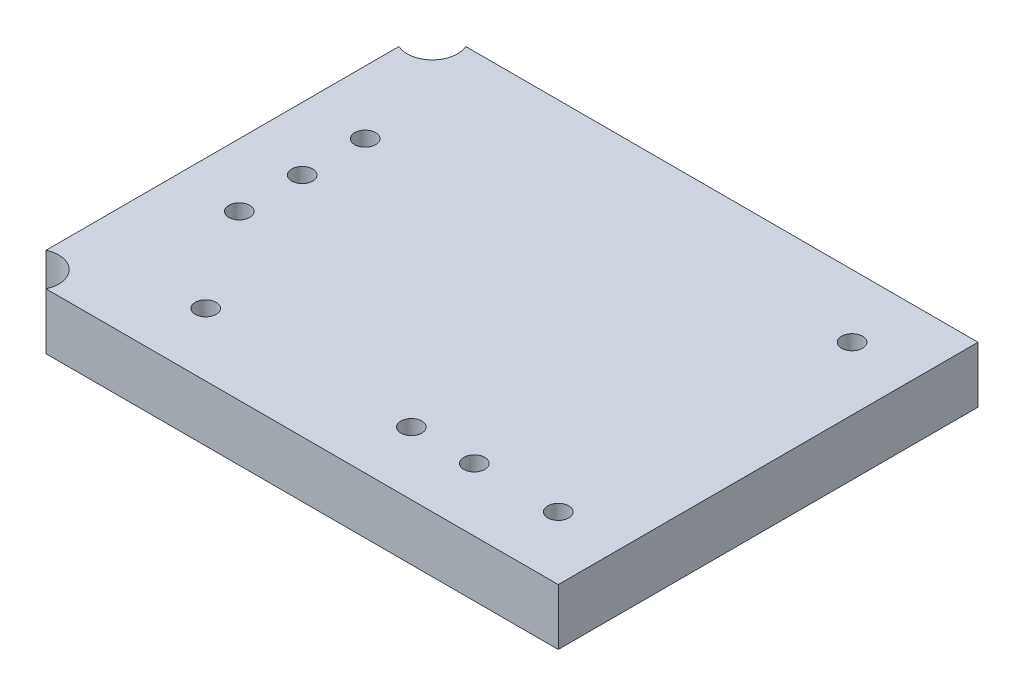
ISO-10303-21;
HEADER;
FILE_DESCRIPTION(('STEP AP214'),'2;1');
FILE_NAME('part.step','',(''),(''),'','','');
FILE_SCHEMA(('AUTOMOTIVE_DESIGN { 1 0 10303 214 1 1 1 1 }'));
ENDSEC;
DATA;
#1=APPLICATION_CONTEXT('core data for automotive mechanical design processes');
#2=APPLICATION_PROTOCOL_DEFINITION('international standard','automotive_design',2000,#1);
#3=PRODUCT_CONTEXT('',#1,'mechanical');
#4=PRODUCT('Part','Part','',(#3));
#5=PRODUCT_RELATED_PRODUCT_CATEGORY('part','',(#4));
#6=PRODUCT_DEFINITION_FORMATION('','',#4);
#7=PRODUCT_DEFINITION_CONTEXT('part definition',#1,'design');
#8=PRODUCT_DEFINITION('design','',#6,#7);
#9=PRODUCT_DEFINITION_SHAPE('','',#8);
#10=(LENGTH_UNIT() NAMED_UNIT(*) SI_UNIT(.MILLI.,.METRE.));
#11=(NAMED_UNIT(*) PLANE_ANGLE_UNIT() SI_UNIT($,.RADIAN.));
#12=(NAMED_UNIT(*) SI_UNIT($,.STERADIAN.) SOLID_ANGLE_UNIT());
#13=UNCERTAINTY_MEASURE_WITH_UNIT(LENGTH_MEASURE(1.E-05),#10,'distance_accuracy_value','');
#14=(GEOMETRIC_REPRESENTATION_CONTEXT(3) GLOBAL_UNCERTAINTY_ASSIGNED_CONTEXT((#13)) GLOBAL_UNIT_ASSIGNED_CONTEXT((#10,
#11,#12)) REPRESENTATION_CONTEXT('',''));
#15=CARTESIAN_POINT('',(0.,0.,0.));
#16=DIRECTION('',(0.,0.,1.));
#17=DIRECTION('',(1.,0.,0.));
#18=AXIS2_PLACEMENT_3D('',#15,#16,#17);
#19=CARTESIAN_POINT('',(6.5,1.34,0.));
#20=DIRECTION('',(1.,0.,0.));
#21=DIRECTION('',(0.,0.,-1.));
#22=AXIS2_PLACEMENT_3D('',#19,#20,#21);
#23=PLANE('',#22);
#24=DIRECTION('',(0.,0.,1.));
#25=VECTOR('',#24,1.);
#26=CARTESIAN_POINT('',(6.5,0.,0.));
#27=LINE('',#26,#25);
#28=CARTESIAN_POINT('',(6.5,0.,-5.));
#29=VERTEX_POINT('',#28);
#30=CARTESIAN_POINT('',(6.5,0.,5.));
#31=VERTEX_POINT('',#30);
#32=EDGE_CURVE('E117',#29,#31,#27,.T.);
#33=ORIENTED_EDGE('',*,*,#32,.F.);
#34=DIRECTION('',(0.,-1.,0.));
#35=VECTOR('',#34,1.);
#36=CARTESIAN_POINT('',(6.5,1.34,-5.));
#37=LINE('',#36,#35);
#38=CARTESIAN_POINT('',(6.5,1.34,-5.));
#39=VERTEX_POINT('',#38);
#40=EDGE_CURVE('E11',#39,#29,#37,.T.);
#41=ORIENTED_EDGE('',*,*,#40,.F.);
#42=DIRECTION('',(0.,0.,1.));
#43=VECTOR('',#42,1.);
#44=CARTESIAN_POINT('',(6.5,1.34,0.));
#45=LINE('',#44,#43);
#46=CARTESIAN_POINT('',(6.5,1.34,5.));
#47=VERTEX_POINT('',#46);
#48=EDGE_CURVE('E132',#39,#47,#45,.T.);
#49=ORIENTED_EDGE('',*,*,#48,.T.);
#50=DIRECTION('',(0.,-1.,0.));
#51=VECTOR('',#50,1.);
#52=CARTESIAN_POINT('',(6.5,1.34,5.));
#53=LINE('',#52,#51);
#54=EDGE_CURVE('E80',#47,#31,#53,.T.);
#55=ORIENTED_EDGE('',*,*,#54,.T.);
#56=EDGE_LOOP('',(#33,#41,#49,#55));
#57=FACE_BOUND('',#56,.T.);
#58=ADVANCED_FACE('F36',(#57),#23,.T.);
#59=CARTESIAN_POINT('',(0.,1.34,-5.));
#60=DIRECTION('',(0.,0.,-1.));
#61=DIRECTION('',(-1.,0.,0.));
#62=AXIS2_PLACEMENT_3D('',#59,#60,#61);
#63=PLANE('',#62);
#64=DIRECTION('',(1.,0.,0.));
#65=VECTOR('',#64,1.);
#66=CARTESIAN_POINT('',(0.,0.,-5.));
#67=LINE('',#66,#65);
#68=CARTESIAN_POINT('',(-5.70456439426821,0.,-5.));
#69=VERTEX_POINT('',#68);
#70=EDGE_CURVE('E120',#69,#29,#67,.T.);
#71=ORIENTED_EDGE('',*,*,#70,.F.);
#72=DIRECTION('',(0.,-1.,0.));
#73=VECTOR('',#72,1.);
#74=CARTESIAN_POINT('',(-5.70456439426821,1.34,-5.));
#75=LINE('',#74,#73);
#76=CARTESIAN_POINT('',(-5.70456439426821,1.34,-5.));
#77=VERTEX_POINT('',#76);
#78=EDGE_CURVE('E44',#77,#69,#75,.T.);
#79=ORIENTED_EDGE('',*,*,#78,.F.);
#80=DIRECTION('',(1.,0.,0.));
#81=VECTOR('',#80,1.);
#82=CARTESIAN_POINT('',(0.,1.34,-5.));
#83=LINE('',#82,#81);
#84=EDGE_CURVE('E145',#77,#39,#83,.T.);
#85=ORIENTED_EDGE('',*,*,#84,.T.);
#86=ORIENTED_EDGE('',*,*,#40,.T.);
#87=EDGE_LOOP('',(#71,#79,#85,#86));
#88=FACE_BOUND('',#87,.T.);
#89=ADVANCED_FACE('F141',(#88),#63,.T.);
#90=CARTESIAN_POINT('',(-6.25,1.34,-4.75));
#91=DIRECTION('',(0.,-1.,0.));
#92=DIRECTION('',(0.,0.,-1.));
#93=AXIS2_PLACEMENT_3D('',#90,#91,#92);
#94=CYLINDRICAL_SURFACE('',#93,0.6);
#95=CARTESIAN_POINT('',(-6.25,0.,-4.75));
#96=DIRECTION('',(0.,1.,0.));
#97=DIRECTION('',(0.,0.,1.));
#98=AXIS2_PLACEMENT_3D('',#95,#96,#97);
#99=CIRCLE('',#98,0.6);
#100=CARTESIAN_POINT('',(-6.5,0.,-4.20456439426822));
#101=VERTEX_POINT('',#100);
#102=EDGE_CURVE('E124',#101,#69,#99,.T.);
#103=ORIENTED_EDGE('',*,*,#102,.F.);
#104=DIRECTION('',(0.,-1.,0.));
#105=VECTOR('',#104,1.);
#106=CARTESIAN_POINT('',(-6.5,1.34,-4.20456439426822));
#107=LINE('',#106,#105);
#108=CARTESIAN_POINT('',(-6.5,1.34,-4.20456439426822));
#109=VERTEX_POINT('',#108);
#110=EDGE_CURVE('E110',#109,#101,#107,.T.);
#111=ORIENTED_EDGE('',*,*,#110,.F.);
#112=CARTESIAN_POINT('',(-6.25,1.34,-4.75));
#113=DIRECTION('',(0.,1.,0.));
#114=DIRECTION('',(0.,0.,1.));
#115=AXIS2_PLACEMENT_3D('',#112,#113,#114);
#116=CIRCLE('',#115,0.6);
#117=EDGE_CURVE('E99',#109,#77,#116,.T.);
#118=ORIENTED_EDGE('',*,*,#117,.T.);
#119=ORIENTED_EDGE('',*,*,#78,.T.);
#120=EDGE_LOOP('',(#103,#111,#118,#119));
#121=FACE_BOUND('',#120,.T.);
#122=ADVANCED_FACE('F138',(#121),#94,.F.);
#123=CARTESIAN_POINT('',(-6.5,1.34,0.));
#124=DIRECTION('',(1.,0.,0.));
#125=DIRECTION('',(0.,0.,-1.));
#126=AXIS2_PLACEMENT_3D('',#123,#124,#125);
#127=PLANE('',#126);
#128=DIRECTION('',(0.,0.,1.));
#129=VECTOR('',#128,1.);
#130=CARTESIAN_POINT('',(-6.5,0.,0.));
#131=LINE('',#130,#129);
#132=CARTESIAN_POINT('',(-6.5,0.,4.20456439426821));
#133=VERTEX_POINT('',#132);
#134=EDGE_CURVE('E106',#101,#133,#131,.T.);
#135=ORIENTED_EDGE('',*,*,#134,.T.);
#136=DIRECTION('',(0.,-1.,0.));
#137=VECTOR('',#136,1.);
#138=CARTESIAN_POINT('',(-6.5,1.34,4.20456439426821));
#139=LINE('',#138,#137);
#140=CARTESIAN_POINT('',(-6.5,1.34,4.20456439426821));
#141=VERTEX_POINT('',#140);
#142=EDGE_CURVE('E103',#141,#133,#139,.T.);
#143=ORIENTED_EDGE('',*,*,#142,.F.);
#144=DIRECTION('',(0.,0.,1.));
#145=VECTOR('',#144,1.);
#146=CARTESIAN_POINT('',(-6.5,1.34,0.));
#147=LINE('',#146,#145);
#148=EDGE_CURVE('E92',#109,#141,#147,.T.);
#149=ORIENTED_EDGE('',*,*,#148,.F.);
#150=ORIENTED_EDGE('',*,*,#110,.T.);
#151=EDGE_LOOP('',(#135,#143,#149,#150));
#152=FACE_BOUND('',#151,.T.);
#153=ADVANCED_FACE('F104',(#152),#127,.F.);
#154=CARTESIAN_POINT('',(-6.25,1.34,4.75));
#155=DIRECTION('',(0.,-1.,0.));
#156=DIRECTION('',(0.,0.,-1.));
#157=AXIS2_PLACEMENT_3D('',#154,#155,#156);
#158=CYLINDRICAL_SURFACE('',#157,0.6);
#159=CARTESIAN_POINT('',(-6.25,0.,4.75));
#160=DIRECTION('',(0.,1.,0.));
#161=DIRECTION('',(0.,0.,1.));
#162=AXIS2_PLACEMENT_3D('',#159,#160,#161);
#163=CIRCLE('',#162,0.6);
#164=CARTESIAN_POINT('',(-5.70456439426821,0.,5.));
#165=VERTEX_POINT('',#164);
#166=EDGE_CURVE('E128',#165,#133,#163,.T.);
#167=ORIENTED_EDGE('',*,*,#166,.F.);
#168=DIRECTION('',(0.,-1.,0.));
#169=VECTOR('',#168,1.);
#170=CARTESIAN_POINT('',(-5.70456439426821,1.34,5.));
#171=LINE('',#170,#169);
#172=CARTESIAN_POINT('',(-5.70456439426821,1.34,5.));
#173=VERTEX_POINT('',#172);
#174=EDGE_CURVE('E73',#173,#165,#171,.T.);
#175=ORIENTED_EDGE('',*,*,#174,.F.);
#176=CARTESIAN_POINT('',(-6.25,1.34,4.75));
#177=DIRECTION('',(0.,1.,0.));
#178=DIRECTION('',(0.,0.,1.));
#179=AXIS2_PLACEMENT_3D('',#176,#177,#178);
#180=CIRCLE('',#179,0.6);
#181=EDGE_CURVE('E96',#173,#141,#180,.T.);
#182=ORIENTED_EDGE('',*,*,#181,.T.);
#183=ORIENTED_EDGE('',*,*,#142,.T.);
#184=EDGE_LOOP('',(#167,#175,#182,#183));
#185=FACE_BOUND('',#184,.T.);
#186=ADVANCED_FACE('F112',(#185),#158,.F.);
#187=CARTESIAN_POINT('',(0.,1.34,5.));
#188=DIRECTION('',(0.,0.,-1.));
#189=DIRECTION('',(-1.,0.,0.));
#190=AXIS2_PLACEMENT_3D('',#187,#188,#189);
#191=PLANE('',#190);
#192=DIRECTION('',(1.,0.,0.));
#193=VECTOR('',#192,1.);
#194=CARTESIAN_POINT('',(0.,0.,5.));
#195=LINE('',#194,#193);
#196=EDGE_CURVE('E130',#165,#31,#195,.T.);
#197=ORIENTED_EDGE('',*,*,#196,.T.);
#198=ORIENTED_EDGE('',*,*,#54,.F.);
#199=DIRECTION('',(1.,0.,0.));
#200=VECTOR('',#199,1.);
#201=CARTESIAN_POINT('',(0.,1.34,5.));
#202=LINE('',#201,#200);
#203=EDGE_CURVE('E52',#173,#47,#202,.T.);
#204=ORIENTED_EDGE('',*,*,#203,.F.);
#205=ORIENTED_EDGE('',*,*,#174,.T.);
#206=EDGE_LOOP('',(#197,#198,#204,#205));
#207=FACE_BOUND('',#206,.T.);
#208=ADVANCED_FACE('F144',(#207),#191,.F.);
#209=CARTESIAN_POINT('',(0.,1.34,0.));
#210=DIRECTION('',(0.,1.,0.));
#211=DIRECTION('',(0.,0.,1.));
#212=AXIS2_PLACEMENT_3D('',#209,#210,#211);
#213=PLANE('',#212);
#214=CARTESIAN_POINT('',(5.,1.34,-3.5));
#215=DIRECTION('',(0.,1.,0.));
#216=DIRECTION('',(0.,0.,1.));
#217=AXIS2_PLACEMENT_3D('',#214,#215,#216);
#218=CIRCLE('',#217,0.25);
#219=CARTESIAN_POINT('',(5.,1.34,-3.25));
#220=VERTEX_POINT('',#219);
#221=EDGE_CURVE('E179',#220,#220,#218,.T.);
#222=ORIENTED_EDGE('',*,*,#221,.F.);
#223=EDGE_LOOP('',(#222));
#224=FACE_BOUND('',#223,.T.);
#225=CARTESIAN_POINT('',(-5.,1.34,1.1));
#226=DIRECTION('',(0.,1.,0.));
#227=DIRECTION('',(0.,0.,1.));
#228=AXIS2_PLACEMENT_3D('',#225,#226,#227);
#229=CIRCLE('',#228,0.25);
#230=CARTESIAN_POINT('',(-5.,1.34,1.35));
#231=VERTEX_POINT('',#230);
#232=EDGE_CURVE('E191',#231,#231,#229,.T.);
#233=ORIENTED_EDGE('',*,*,#232,.F.);
#234=EDGE_LOOP('',(#233));
#235=FACE_BOUND('',#234,.T.);
#236=CARTESIAN_POINT('',(-5.,1.34,-0.400000000000003));
#237=DIRECTION('',(0.,1.,0.));
#238=DIRECTION('',(0.,0.,1.));
#239=AXIS2_PLACEMENT_3D('',#236,#237,#238);
#240=CIRCLE('',#239,0.25);
#241=CARTESIAN_POINT('',(-5.,1.34,-0.150000000000002));
#242=VERTEX_POINT('',#241);
#243=EDGE_CURVE('E180',#242,#242,#240,.T.);
#244=ORIENTED_EDGE('',*,*,#243,.F.);
#245=EDGE_LOOP('',(#244));
#246=FACE_BOUND('',#245,.T.);
#247=CARTESIAN_POINT('',(5.,1.34,3.5));
#248=DIRECTION('',(0.,1.,0.));
#249=DIRECTION('',(0.,0.,1.));
#250=AXIS2_PLACEMENT_3D('',#247,#248,#249);
#251=CIRCLE('',#250,0.25);
#252=CARTESIAN_POINT('',(5.,1.34,3.75));
#253=VERTEX_POINT('',#252);
#254=EDGE_CURVE('E173',#253,#253,#251,.T.);
#255=ORIENTED_EDGE('',*,*,#254,.F.);
#256=EDGE_LOOP('',(#255));
#257=FACE_BOUND('',#256,.T.);
#258=CARTESIAN_POINT('',(3.,1.34,3.5));
#259=DIRECTION('',(0.,1.,0.));
#260=DIRECTION('',(0.,0.,1.));
#261=AXIS2_PLACEMENT_3D('',#258,#259,#260);
#262=CIRCLE('',#261,0.250000000000001);
#263=CARTESIAN_POINT('',(3.,1.34,3.75));
#264=VERTEX_POINT('',#263);
#265=EDGE_CURVE('E167',#264,#264,#262,.T.);
#266=ORIENTED_EDGE('',*,*,#265,.F.);
#267=EDGE_LOOP('',(#266));
#268=FACE_BOUND('',#267,.T.);
#269=CARTESIAN_POINT('',(1.5,1.34,3.5));
#270=DIRECTION('',(0.,1.,0.));
#271=DIRECTION('',(0.,0.,1.));
#272=AXIS2_PLACEMENT_3D('',#269,#270,#271);
#273=CIRCLE('',#272,0.25);
#274=CARTESIAN_POINT('',(1.5,1.34,3.75));
#275=VERTEX_POINT('',#274);
#276=EDGE_CURVE('E161',#275,#275,#273,.T.);
#277=ORIENTED_EDGE('',*,*,#276,.F.);
#278=EDGE_LOOP('',(#277));
#279=FACE_BOUND('',#278,.T.);
#280=CARTESIAN_POINT('',(-3.4,1.34,3.5));
#281=DIRECTION('',(0.,1.,0.));
#282=DIRECTION('',(0.,0.,1.));
#283=AXIS2_PLACEMENT_3D('',#280,#281,#282);
#284=CIRCLE('',#283,0.250000000000001);
#285=CARTESIAN_POINT('',(-3.4,1.34,3.75));
#286=VERTEX_POINT('',#285);
#287=EDGE_CURVE('E155',#286,#286,#284,.T.);
#288=ORIENTED_EDGE('',*,*,#287,.F.);
#289=EDGE_LOOP('',(#288));
#290=FACE_BOUND('',#289,.T.);
#291=CARTESIAN_POINT('',(-5.,1.34,-1.9));
#292=DIRECTION('',(0.,1.,0.));
#293=DIRECTION('',(0.,0.,1.));
#294=AXIS2_PLACEMENT_3D('',#291,#292,#293);
#295=CIRCLE('',#294,0.25);
#296=CARTESIAN_POINT('',(-5.,1.34,-1.65));
#297=VERTEX_POINT('',#296);
#298=EDGE_CURVE('E149',#297,#297,#295,.T.);
#299=ORIENTED_EDGE('',*,*,#298,.F.);
#300=EDGE_LOOP('',(#299));
#301=FACE_BOUND('',#300,.T.);
#302=ORIENTED_EDGE('',*,*,#48,.F.);
#303=ORIENTED_EDGE('',*,*,#84,.F.);
#304=ORIENTED_EDGE('',*,*,#117,.F.);
#305=ORIENTED_EDGE('',*,*,#148,.T.);
#306=ORIENTED_EDGE('',*,*,#181,.F.);
#307=ORIENTED_EDGE('',*,*,#203,.T.);
#308=EDGE_LOOP('',(#302,#303,#304,#305,#306,#307));
#309=FACE_BOUND('',#308,.T.);
#310=ADVANCED_FACE('F94',(#224,#235,#246,#257,#268,#279,#290,#301,#309),#213,.T.);
#311=CARTESIAN_POINT('',(0.,0.,0.));
#312=DIRECTION('',(0.,1.,0.));
#313=DIRECTION('',(0.,0.,1.));
#314=AXIS2_PLACEMENT_3D('',#311,#312,#313);
#315=PLANE('',#314);
#316=CARTESIAN_POINT('',(5.,0.,-3.5));
#317=DIRECTION('',(0.,1.,0.));
#318=DIRECTION('',(0.,0.,1.));
#319=AXIS2_PLACEMENT_3D('',#316,#317,#318);
#320=CIRCLE('',#319,0.25);
#321=CARTESIAN_POINT('',(5.,0.,-3.25));
#322=VERTEX_POINT('',#321);
#323=EDGE_CURVE('E188',#322,#322,#320,.T.);
#324=ORIENTED_EDGE('',*,*,#323,.T.);
#325=EDGE_LOOP('',(#324));
#326=FACE_BOUND('',#325,.T.);
#327=CARTESIAN_POINT('',(-5.,0.,1.1));
#328=DIRECTION('',(0.,1.,0.));
#329=DIRECTION('',(0.,0.,1.));
#330=AXIS2_PLACEMENT_3D('',#327,#328,#329);
#331=CIRCLE('',#330,0.25);
#332=CARTESIAN_POINT('',(-5.,0.,1.35));
#333=VERTEX_POINT('',#332);
#334=EDGE_CURVE('E183',#333,#333,#331,.T.);
#335=ORIENTED_EDGE('',*,*,#334,.T.);
#336=EDGE_LOOP('',(#335));
#337=FACE_BOUND('',#336,.T.);
#338=CARTESIAN_POINT('',(-5.,0.,-0.400000000000003));
#339=DIRECTION('',(0.,1.,0.));
#340=DIRECTION('',(0.,0.,1.));
#341=AXIS2_PLACEMENT_3D('',#338,#339,#340);
#342=CIRCLE('',#341,0.25);
#343=CARTESIAN_POINT('',(-5.,0.,-0.150000000000002));
#344=VERTEX_POINT('',#343);
#345=EDGE_CURVE('E152',#344,#344,#342,.T.);
#346=ORIENTED_EDGE('',*,*,#345,.T.);
#347=EDGE_LOOP('',(#346));
#348=FACE_BOUND('',#347,.T.);
#349=CARTESIAN_POINT('',(5.,0.,3.5));
#350=DIRECTION('',(0.,1.,0.));
#351=DIRECTION('',(0.,0.,1.));
#352=AXIS2_PLACEMENT_3D('',#349,#350,#351);
#353=CIRCLE('',#352,0.25);
#354=CARTESIAN_POINT('',(5.,0.,3.75));
#355=VERTEX_POINT('',#354);
#356=EDGE_CURVE('E176',#355,#355,#353,.T.);
#357=ORIENTED_EDGE('',*,*,#356,.T.);
#358=EDGE_LOOP('',(#357));
#359=FACE_BOUND('',#358,.T.);
#360=CARTESIAN_POINT('',(3.,0.,3.5));
#361=DIRECTION('',(0.,1.,0.));
#362=DIRECTION('',(0.,0.,1.));
#363=AXIS2_PLACEMENT_3D('',#360,#361,#362);
#364=CIRCLE('',#363,0.250000000000001);
#365=CARTESIAN_POINT('',(3.,0.,3.75));
#366=VERTEX_POINT('',#365);
#367=EDGE_CURVE('E170',#366,#366,#364,.T.);
#368=ORIENTED_EDGE('',*,*,#367,.T.);
#369=EDGE_LOOP('',(#368));
#370=FACE_BOUND('',#369,.T.);
#371=CARTESIAN_POINT('',(1.5,0.,3.5));
#372=DIRECTION('',(0.,1.,0.));
#373=DIRECTION('',(0.,0.,1.));
#374=AXIS2_PLACEMENT_3D('',#371,#372,#373);
#375=CIRCLE('',#374,0.25);
#376=CARTESIAN_POINT('',(1.5,0.,3.75));
#377=VERTEX_POINT('',#376);
#378=EDGE_CURVE('E164',#377,#377,#375,.T.);
#379=ORIENTED_EDGE('',*,*,#378,.T.);
#380=EDGE_LOOP('',(#379));
#381=FACE_BOUND('',#380,.T.);
#382=CARTESIAN_POINT('',(-3.4,0.,3.5));
#383=DIRECTION('',(0.,1.,0.));
#384=DIRECTION('',(0.,0.,1.));
#385=AXIS2_PLACEMENT_3D('',#382,#383,#384);
#386=CIRCLE('',#385,0.250000000000001);
#387=CARTESIAN_POINT('',(-3.4,0.,3.75));
#388=VERTEX_POINT('',#387);
#389=EDGE_CURVE('E158',#388,#388,#386,.T.);
#390=ORIENTED_EDGE('',*,*,#389,.T.);
#391=EDGE_LOOP('',(#390));
#392=FACE_BOUND('',#391,.T.);
#393=CARTESIAN_POINT('',(-5.,0.,-1.9));
#394=DIRECTION('',(0.,1.,0.));
#395=DIRECTION('',(0.,0.,1.));
#396=AXIS2_PLACEMENT_3D('',#393,#394,#395);
#397=CIRCLE('',#396,0.25);
#398=CARTESIAN_POINT('',(-5.,0.,-1.65));
#399=VERTEX_POINT('',#398);
#400=EDGE_CURVE('E121',#399,#399,#397,.T.);
#401=ORIENTED_EDGE('',*,*,#400,.T.);
#402=EDGE_LOOP('',(#401));
#403=FACE_BOUND('',#402,.T.);
#404=ORIENTED_EDGE('',*,*,#32,.T.);
#405=ORIENTED_EDGE('',*,*,#196,.F.);
#406=ORIENTED_EDGE('',*,*,#166,.T.);
#407=ORIENTED_EDGE('',*,*,#134,.F.);
#408=ORIENTED_EDGE('',*,*,#102,.T.);
#409=ORIENTED_EDGE('',*,*,#70,.T.);
#410=EDGE_LOOP('',(#404,#405,#406,#407,#408,#409));
#411=FACE_BOUND('',#410,.T.);
#412=ADVANCED_FACE('F143',(#326,#337,#348,#359,#370,#381,#392,#403,#411),#315,.F.);
#413=CARTESIAN_POINT('',(-5.,0.,-1.9));
#414=DIRECTION('',(0.,1.,0.));
#415=DIRECTION('',(0.,0.,1.));
#416=AXIS2_PLACEMENT_3D('',#413,#414,#415);
#417=CYLINDRICAL_SURFACE('',#416,0.25);
#418=ORIENTED_EDGE('',*,*,#400,.F.);
#419=EDGE_LOOP('',(#418));
#420=FACE_BOUND('',#419,.T.);
#421=ORIENTED_EDGE('',*,*,#298,.T.);
#422=EDGE_LOOP('',(#421));
#423=FACE_BOUND('',#422,.T.);
#424=ADVANCED_FACE('F223',(#420,#423),#417,.F.);
#425=CARTESIAN_POINT('',(-3.4,0.,3.5));
#426=DIRECTION('',(0.,1.,0.));
#427=DIRECTION('',(0.,0.,1.));
#428=AXIS2_PLACEMENT_3D('',#425,#426,#427);
#429=CYLINDRICAL_SURFACE('',#428,0.250000000000001);
#430=ORIENTED_EDGE('',*,*,#389,.F.);
#431=EDGE_LOOP('',(#430));
#432=FACE_BOUND('',#431,.T.);
#433=ORIENTED_EDGE('',*,*,#287,.T.);
#434=EDGE_LOOP('',(#433));
#435=FACE_BOUND('',#434,.T.);
#436=ADVANCED_FACE('F225',(#432,#435),#429,.F.);
#437=CARTESIAN_POINT('',(1.5,0.,3.5));
#438=DIRECTION('',(0.,1.,0.));
#439=DIRECTION('',(0.,0.,1.));
#440=AXIS2_PLACEMENT_3D('',#437,#438,#439);
#441=CYLINDRICAL_SURFACE('',#440,0.25);
#442=ORIENTED_EDGE('',*,*,#378,.F.);
#443=EDGE_LOOP('',(#442));
#444=FACE_BOUND('',#443,.T.);
#445=ORIENTED_EDGE('',*,*,#276,.T.);
#446=EDGE_LOOP('',(#445));
#447=FACE_BOUND('',#446,.T.);
#448=ADVANCED_FACE('F232',(#444,#447),#441,.F.);
#449=CARTESIAN_POINT('',(3.,0.,3.5));
#450=DIRECTION('',(0.,1.,0.));
#451=DIRECTION('',(0.,0.,1.));
#452=AXIS2_PLACEMENT_3D('',#449,#450,#451);
#453=CYLINDRICAL_SURFACE('',#452,0.250000000000001);
#454=ORIENTED_EDGE('',*,*,#367,.F.);
#455=EDGE_LOOP('',(#454));
#456=FACE_BOUND('',#455,.T.);
#457=ORIENTED_EDGE('',*,*,#265,.T.);
#458=EDGE_LOOP('',(#457));
#459=FACE_BOUND('',#458,.T.);
#460=ADVANCED_FACE('F284',(#456,#459),#453,.F.);
#461=CARTESIAN_POINT('',(5.,0.,3.5));
#462=DIRECTION('',(0.,1.,0.));
#463=DIRECTION('',(0.,0.,1.));
#464=AXIS2_PLACEMENT_3D('',#461,#462,#463);
#465=CYLINDRICAL_SURFACE('',#464,0.25);
#466=ORIENTED_EDGE('',*,*,#356,.F.);
#467=EDGE_LOOP('',(#466));
#468=FACE_BOUND('',#467,.T.);
#469=ORIENTED_EDGE('',*,*,#254,.T.);
#470=EDGE_LOOP('',(#469));
#471=FACE_BOUND('',#470,.T.);
#472=ADVANCED_FACE('F294',(#468,#471),#465,.F.);
#473=CARTESIAN_POINT('',(-5.,0.,-0.400000000000003));
#474=DIRECTION('',(0.,1.,0.));
#475=DIRECTION('',(0.,0.,1.));
#476=AXIS2_PLACEMENT_3D('',#473,#474,#475);
#477=CYLINDRICAL_SURFACE('',#476,0.25);
#478=ORIENTED_EDGE('',*,*,#345,.F.);
#479=EDGE_LOOP('',(#478));
#480=FACE_BOUND('',#479,.T.);
#481=ORIENTED_EDGE('',*,*,#243,.T.);
#482=EDGE_LOOP('',(#481));
#483=FACE_BOUND('',#482,.T.);
#484=ADVANCED_FACE('F203',(#480,#483),#477,.F.);
#485=CARTESIAN_POINT('',(-5.,0.,1.1));
#486=DIRECTION('',(0.,1.,0.));
#487=DIRECTION('',(0.,0.,1.));
#488=AXIS2_PLACEMENT_3D('',#485,#486,#487);
#489=CYLINDRICAL_SURFACE('',#488,0.25);
#490=ORIENTED_EDGE('',*,*,#334,.F.);
#491=EDGE_LOOP('',(#490));
#492=FACE_BOUND('',#491,.T.);
#493=ORIENTED_EDGE('',*,*,#232,.T.);
#494=EDGE_LOOP('',(#493));
#495=FACE_BOUND('',#494,.T.);
#496=ADVANCED_FACE('F199',(#492,#495),#489,.F.);
#497=CARTESIAN_POINT('',(5.,0.,-3.5));
#498=DIRECTION('',(0.,1.,0.));
#499=DIRECTION('',(0.,0.,1.));
#500=AXIS2_PLACEMENT_3D('',#497,#498,#499);
#501=CYLINDRICAL_SURFACE('',#500,0.25);
#502=ORIENTED_EDGE('',*,*,#323,.F.);
#503=EDGE_LOOP('',(#502));
#504=FACE_BOUND('',#503,.T.);
#505=ORIENTED_EDGE('',*,*,#221,.T.);
#506=EDGE_LOOP('',(#505));
#507=FACE_BOUND('',#506,.T.);
#508=ADVANCED_FACE('F202',(#504,#507),#501,.F.);
#509=CLOSED_SHELL('',(#58,#89,#122,#153,#186,#208,#310,#412,#424,#436,#448,#460,#472,#484,#496,#508));
#510=MANIFOLD_SOLID_BREP('B2',#509);
#511=ADVANCED_BREP_SHAPE_REPRESENTATION('',(#18,#510),#14);
#512=SHAPE_DEFINITION_REPRESENTATION(#9,#511);
ENDSEC;
END-ISO-10303-21;
